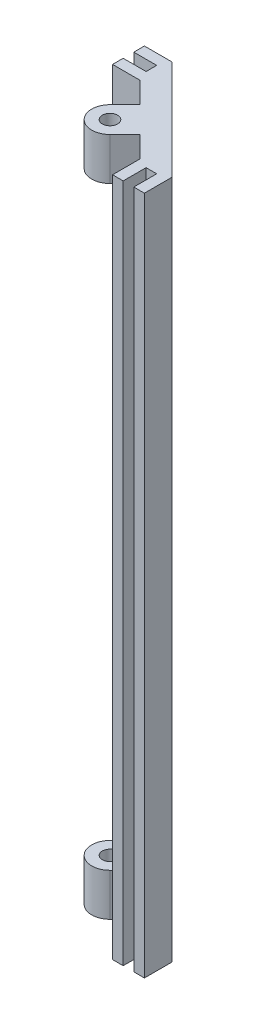
ISO-10303-21;
HEADER;
FILE_DESCRIPTION(('STEP AP214'),'2;1');
FILE_NAME('part.step','',(''),(''),'','','');
FILE_SCHEMA(('AUTOMOTIVE_DESIGN { 1 0 10303 214 1 1 1 1 }'));
ENDSEC;
DATA;
#1=APPLICATION_CONTEXT('core data for automotive mechanical design processes');
#2=APPLICATION_PROTOCOL_DEFINITION('international standard','automotive_design',2000,#1);
#3=PRODUCT_CONTEXT('',#1,'mechanical');
#4=PRODUCT('Part','Part','',(#3));
#5=PRODUCT_RELATED_PRODUCT_CATEGORY('part','',(#4));
#6=PRODUCT_DEFINITION_FORMATION('','',#4);
#7=PRODUCT_DEFINITION_CONTEXT('part definition',#1,'design');
#8=PRODUCT_DEFINITION('design','',#6,#7);
#9=PRODUCT_DEFINITION_SHAPE('','',#8);
#10=(LENGTH_UNIT() NAMED_UNIT(*) SI_UNIT(.MILLI.,.METRE.));
#11=(NAMED_UNIT(*) PLANE_ANGLE_UNIT() SI_UNIT($,.RADIAN.));
#12=(NAMED_UNIT(*) SI_UNIT($,.STERADIAN.) SOLID_ANGLE_UNIT());
#13=UNCERTAINTY_MEASURE_WITH_UNIT(LENGTH_MEASURE(1.E-05),#10,'distance_accuracy_value','');
#14=(GEOMETRIC_REPRESENTATION_CONTEXT(3) GLOBAL_UNCERTAINTY_ASSIGNED_CONTEXT((#13)) GLOBAL_UNIT_ASSIGNED_CONTEXT((#10,
#11,#12)) REPRESENTATION_CONTEXT('',''));
#15=CARTESIAN_POINT('',(0.,0.,0.));
#16=DIRECTION('',(0.,0.,1.));
#17=DIRECTION('',(1.,0.,0.));
#18=AXIS2_PLACEMENT_3D('',#15,#16,#17);
#19=CARTESIAN_POINT('',(22.2539461017924,203.2,-14.530925837673));
#20=DIRECTION('',(0.707106781186547,0.,-0.707106781186548));
#21=DIRECTION('',(-0.707106781186548,0.,-0.707106781186547));
#22=AXIS2_PLACEMENT_3D('',#19,#20,#21);
#23=PLANE('',#22);
#24=DIRECTION('',(0.,-1.,0.));
#25=VECTOR('',#24,1.);
#26=CARTESIAN_POINT('',(16.1473719394654,190.5,-20.6375));
#27=LINE('',#26,#25);
#28=CARTESIAN_POINT('',(16.1473719394654,190.5,-20.6375));
#29=VERTEX_POINT('',#28);
#30=CARTESIAN_POINT('',(16.1473719394654,12.7,-20.6375));
#31=VERTEX_POINT('',#30);
#32=EDGE_CURVE('E256',#29,#31,#27,.T.);
#33=ORIENTED_EDGE('',*,*,#32,.F.);
#34=DIRECTION('',(-0.707106781186554,0.,-0.707106781186541));
#35=VECTOR('',#34,1.);
#36=CARTESIAN_POINT('',(22.2539461017925,190.5,-14.530925837673));
#37=LINE('',#36,#35);
#38=CARTESIAN_POINT('',(14.5309258376729,190.5,-22.2539461017924));
#39=VERTEX_POINT('',#38);
#40=EDGE_CURVE('E269',#29,#39,#37,.T.);
#41=ORIENTED_EDGE('',*,*,#40,.T.);
#42=DIRECTION('',(0.,-1.,0.));
#43=VECTOR('',#42,1.);
#44=CARTESIAN_POINT('',(14.530925837673,203.2,-22.2539461017924));
#45=LINE('',#44,#43);
#46=CARTESIAN_POINT('',(14.530925837673,203.2,-22.2539461017924));
#47=VERTEX_POINT('',#46);
#48=EDGE_CURVE('E474',#47,#39,#45,.T.);
#49=ORIENTED_EDGE('',*,*,#48,.F.);
#50=DIRECTION('',(0.707106781186547,0.,0.707106781186548));
#51=VECTOR('',#50,1.);
#52=CARTESIAN_POINT('',(8.20987193946542,203.2,-28.575));
#53=LINE('',#52,#51);
#54=CARTESIAN_POINT('',(8.20987193946542,203.2,-28.575));
#55=VERTEX_POINT('',#54);
#56=EDGE_CURVE('E341',#55,#47,#53,.T.);
#57=ORIENTED_EDGE('',*,*,#56,.F.);
#58=DIRECTION('',(0.,-1.,0.));
#59=VECTOR('',#58,1.);
#60=CARTESIAN_POINT('',(8.20987193946542,203.2,-28.575));
#61=LINE('',#60,#59);
#62=CARTESIAN_POINT('',(8.20987193946542,0.,-28.575));
#63=VERTEX_POINT('',#62);
#64=EDGE_CURVE('E478',#55,#63,#61,.T.);
#65=ORIENTED_EDGE('',*,*,#64,.T.);
#66=DIRECTION('',(0.707106781186547,0.,0.707106781186548));
#67=VECTOR('',#66,1.);
#68=CARTESIAN_POINT('',(8.20987193946542,0.,-28.575));
#69=LINE('',#68,#67);
#70=CARTESIAN_POINT('',(14.530925837673,0.,-22.2539461017924));
#71=VERTEX_POINT('',#70);
#72=EDGE_CURVE('E402',#63,#71,#69,.T.);
#73=ORIENTED_EDGE('',*,*,#72,.T.);
#74=CARTESIAN_POINT('',(14.5309258376731,12.7,-22.2539461017922));
#75=VERTEX_POINT('',#74);
#76=EDGE_CURVE('E473',#75,#71,#45,.T.);
#77=ORIENTED_EDGE('',*,*,#76,.F.);
#78=DIRECTION('',(0.707106781186554,0.,0.707106781186541));
#79=VECTOR('',#78,1.);
#80=CARTESIAN_POINT('',(22.2539461017927,12.7,-14.5309258376728));
#81=LINE('',#80,#79);
#82=EDGE_CURVE('E274',#75,#31,#81,.T.);
#83=ORIENTED_EDGE('',*,*,#82,.T.);
#84=EDGE_LOOP('',(#33,#41,#49,#57,#65,#73,#77,#83));
#85=FACE_BOUND('',#84,.T.);
#86=ADVANCED_FACE('F39',(#85),#23,.F.);
#87=DIRECTION('',(0.,1.,0.));
#88=VECTOR('',#87,1.);
#89=CARTESIAN_POINT('',(20.6375,190.5,-16.1473719394654));
#90=LINE('',#89,#88);
#91=CARTESIAN_POINT('',(20.6375,12.7,-16.1473719394654));
#92=VERTEX_POINT('',#91);
#93=CARTESIAN_POINT('',(20.6375,190.5,-16.1473719394654));
#94=VERTEX_POINT('',#93);
#95=EDGE_CURVE('E260',#92,#94,#90,.T.);
#96=ORIENTED_EDGE('',*,*,#95,.F.);
#97=CARTESIAN_POINT('',(22.2539461017924,12.7,-14.530925837673));
#98=VERTEX_POINT('',#97);
#99=EDGE_CURVE('E232',#92,#98,#81,.T.);
#100=ORIENTED_EDGE('',*,*,#99,.T.);
#101=DIRECTION('',(0.,-1.,0.));
#102=VECTOR('',#101,1.);
#103=CARTESIAN_POINT('',(22.2539461017924,203.2,-14.530925837673));
#104=LINE('',#103,#102);
#105=CARTESIAN_POINT('',(22.2539461017924,0.,-14.530925837673));
#106=VERTEX_POINT('',#105);
#107=EDGE_CURVE('E458',#98,#106,#104,.T.);
#108=ORIENTED_EDGE('',*,*,#107,.T.);
#109=DIRECTION('',(0.707106781186548,0.,0.707106781186547));
#110=VECTOR('',#109,1.);
#111=CARTESIAN_POINT('',(22.2539461017924,0.,-14.530925837673));
#112=LINE('',#111,#110);
#113=CARTESIAN_POINT('',(28.575,0.,-8.20987193946542));
#114=VERTEX_POINT('',#113);
#115=EDGE_CURVE('E418',#106,#114,#112,.T.);
#116=ORIENTED_EDGE('',*,*,#115,.T.);
#117=DIRECTION('',(0.,-1.,0.));
#118=VECTOR('',#117,1.);
#119=CARTESIAN_POINT('',(28.575,203.2,-8.20987193946542));
#120=LINE('',#119,#118);
#121=CARTESIAN_POINT('',(28.575,203.2,-8.20987193946542));
#122=VERTEX_POINT('',#121);
#123=EDGE_CURVE('E454',#122,#114,#120,.T.);
#124=ORIENTED_EDGE('',*,*,#123,.F.);
#125=DIRECTION('',(0.707106781186548,0.,0.707106781186547));
#126=VECTOR('',#125,1.);
#127=CARTESIAN_POINT('',(22.2539461017924,203.2,-14.530925837673));
#128=LINE('',#127,#126);
#129=CARTESIAN_POINT('',(22.2539461017924,203.2,-14.530925837673));
#130=VERTEX_POINT('',#129);
#131=EDGE_CURVE('E353',#130,#122,#128,.T.);
#132=ORIENTED_EDGE('',*,*,#131,.F.);
#133=CARTESIAN_POINT('',(22.2539461017925,190.5,-14.530925837673));
#134=VERTEX_POINT('',#133);
#135=EDGE_CURVE('E459',#130,#134,#104,.T.);
#136=ORIENTED_EDGE('',*,*,#135,.T.);
#137=EDGE_CURVE('E270',#134,#94,#37,.T.);
#138=ORIENTED_EDGE('',*,*,#137,.T.);
#139=EDGE_LOOP('',(#96,#100,#108,#116,#124,#132,#136,#138));
#140=FACE_BOUND('',#139,.T.);
#141=ADVANCED_FACE('F529',(#140),#23,.F.);
#142=CARTESIAN_POINT('',(13.9023079091982,190.5,-6.17928764507862));
#143=DIRECTION('',(0.,-1.,0.));
#144=DIRECTION('',(0.,0.,-1.));
#145=AXIS2_PLACEMENT_3D('',#142,#143,#144);
#146=PLANE('',#145);
#147=CARTESIAN_POINT('',(13.9023079091981,190.5,-13.9023079091981));
#148=DIRECTION('',(0.,-1.,0.));
#149=DIRECTION('',(0.,0.,-1.));
#150=AXIS2_PLACEMENT_3D('',#147,#148,#149);
#151=CIRCLE('',#150,2.286);
#152=CARTESIAN_POINT('',(13.9023079091981,190.5,-16.1883079091981));
#153=VERTEX_POINT('',#152);
#154=EDGE_CURVE('E43',#153,#153,#151,.T.);
#155=ORIENTED_EDGE('',*,*,#154,.F.);
#156=EDGE_LOOP('',(#155));
#157=FACE_BOUND('',#156,.T.);
#158=ORIENTED_EDGE('',*,*,#40,.F.);
#159=DIRECTION('',(0.707106781186547,0.,-0.707106781186548));
#160=VECTOR('',#159,1.);
#161=CARTESIAN_POINT('',(15.2493463273585,190.5,-19.7394743878931));
#162=LINE('',#161,#160);
#163=CARTESIAN_POINT('',(15.2493463273585,190.5,-19.7394743878931));
#164=VERTEX_POINT('',#163);
#165=EDGE_CURVE('E57',#164,#29,#162,.T.);
#166=ORIENTED_EDGE('',*,*,#165,.F.);
#167=DIRECTION('',(-0.707106781186548,0.,-0.707106781186547));
#168=VECTOR('',#167,1.);
#169=CARTESIAN_POINT('',(15.2493463273585,190.5,-19.7394743878931));
#170=LINE('',#169,#168);
#171=CARTESIAN_POINT('',(19.7394743878931,190.5,-15.2493463273585));
#172=VERTEX_POINT('',#171);
#173=EDGE_CURVE('E61',#172,#164,#170,.T.);
#174=ORIENTED_EDGE('',*,*,#173,.F.);
#175=DIRECTION('',(0.707106781186547,0.,-0.707106781186548));
#176=VECTOR('',#175,1.);
#177=CARTESIAN_POINT('',(19.7394743878931,190.5,-15.2493463273585));
#178=LINE('',#177,#176);
#179=EDGE_CURVE('E238',#172,#94,#178,.T.);
#180=ORIENTED_EDGE('',*,*,#179,.T.);
#181=ORIENTED_EDGE('',*,*,#137,.F.);
#182=DIRECTION('',(0.707106781186541,0.,-0.707106781186554));
#183=VECTOR('',#182,1.);
#184=CARTESIAN_POINT('',(13.9023079091982,190.5,-6.17928764507862));
#185=LINE('',#184,#183);
#186=CARTESIAN_POINT('',(17.7638180412579,190.5,-10.0407977771384));
#187=VERTEX_POINT('',#186);
#188=EDGE_CURVE('E289',#187,#134,#185,.T.);
#189=ORIENTED_EDGE('',*,*,#188,.F.);
#190=CARTESIAN_POINT('',(13.9023079091981,190.5,-13.9023079091981));
#191=DIRECTION('',(0.,-1.,0.));
#192=DIRECTION('',(0.,0.,-1.));
#193=AXIS2_PLACEMENT_3D('',#190,#191,#192);
#194=CIRCLE('',#193,5.461);
#195=CARTESIAN_POINT('',(10.0407977771384,190.5,-17.7638180412578));
#196=VERTEX_POINT('',#195);
#197=EDGE_CURVE('E297',#187,#196,#194,.T.);
#198=ORIENTED_EDGE('',*,*,#197,.T.);
#199=DIRECTION('',(0.707106781186541,0.,-0.707106781186554));
#200=VECTOR('',#199,1.);
#201=CARTESIAN_POINT('',(6.17928764507871,190.5,-13.902307909198));
#202=LINE('',#201,#200);
#203=EDGE_CURVE('E285',#196,#39,#202,.T.);
#204=ORIENTED_EDGE('',*,*,#203,.T.);
#205=EDGE_LOOP('',(#158,#166,#174,#180,#181,#189,#198,#204));
#206=FACE_BOUND('',#205,.T.);
#207=ADVANCED_FACE('F520',(#157,#206),#146,.T.);
#208=CARTESIAN_POINT('',(13.9023079091984,12.7,-6.17928764507842));
#209=DIRECTION('',(0.,1.,0.));
#210=DIRECTION('',(-1.,0.,0.));
#211=AXIS2_PLACEMENT_3D('',#208,#209,#210);
#212=PLANE('',#211);
#213=CARTESIAN_POINT('',(13.9023079091981,12.7,-13.9023079091981));
#214=DIRECTION('',(0.,1.,0.));
#215=DIRECTION('',(-1.,0.,0.));
#216=AXIS2_PLACEMENT_3D('',#213,#214,#215);
#217=CIRCLE('',#216,2.286);
#218=CARTESIAN_POINT('',(11.6163079091981,12.7,-13.9023079091981));
#219=VERTEX_POINT('',#218);
#220=EDGE_CURVE('E293',#219,#219,#217,.T.);
#221=ORIENTED_EDGE('',*,*,#220,.F.);
#222=EDGE_LOOP('',(#221));
#223=FACE_BOUND('',#222,.T.);
#224=DIRECTION('',(0.707106781186548,0.,0.707106781186547));
#225=VECTOR('',#224,1.);
#226=CARTESIAN_POINT('',(15.2493463273585,12.7,-19.7394743878931));
#227=LINE('',#226,#225);
#228=CARTESIAN_POINT('',(15.2493463273585,12.7,-19.7394743878931));
#229=VERTEX_POINT('',#228);
#230=CARTESIAN_POINT('',(19.7394743878931,12.7,-15.2493463273585));
#231=VERTEX_POINT('',#230);
#232=EDGE_CURVE('E229',#229,#231,#227,.T.);
#233=ORIENTED_EDGE('',*,*,#232,.F.);
#234=DIRECTION('',(0.707106781186547,0.,-0.707106781186548));
#235=VECTOR('',#234,1.);
#236=CARTESIAN_POINT('',(15.2493463273585,12.7,-19.7394743878931));
#237=LINE('',#236,#235);
#238=EDGE_CURVE('E237',#229,#31,#237,.T.);
#239=ORIENTED_EDGE('',*,*,#238,.T.);
#240=ORIENTED_EDGE('',*,*,#82,.F.);
#241=DIRECTION('',(0.707106781186541,0.,-0.707106781186554));
#242=VECTOR('',#241,1.);
#243=CARTESIAN_POINT('',(6.17928764507891,12.7,-13.9023079091978));
#244=LINE('',#243,#242);
#245=CARTESIAN_POINT('',(10.0407977771386,12.7,-17.7638180412576));
#246=VERTEX_POINT('',#245);
#247=EDGE_CURVE('E281',#246,#75,#244,.T.);
#248=ORIENTED_EDGE('',*,*,#247,.F.);
#249=CARTESIAN_POINT('',(13.9023079091981,12.7,-13.9023079091981));
#250=DIRECTION('',(0.,1.,0.));
#251=DIRECTION('',(-1.,0.,0.));
#252=AXIS2_PLACEMENT_3D('',#249,#250,#251);
#253=CIRCLE('',#252,5.461);
#254=CARTESIAN_POINT('',(17.7638180412581,12.7,-10.0407977771382));
#255=VERTEX_POINT('',#254);
#256=EDGE_CURVE('E294',#246,#255,#253,.T.);
#257=ORIENTED_EDGE('',*,*,#256,.T.);
#258=DIRECTION('',(0.707106781186541,0.,-0.707106781186554));
#259=VECTOR('',#258,1.);
#260=CARTESIAN_POINT('',(13.9023079091984,12.7,-6.17928764507842));
#261=LINE('',#260,#259);
#262=EDGE_CURVE('E278',#255,#98,#261,.T.);
#263=ORIENTED_EDGE('',*,*,#262,.T.);
#264=ORIENTED_EDGE('',*,*,#99,.F.);
#265=DIRECTION('',(0.707106781186547,0.,-0.707106781186548));
#266=VECTOR('',#265,1.);
#267=CARTESIAN_POINT('',(19.7394743878931,12.7,-15.2493463273585));
#268=LINE('',#267,#266);
#269=EDGE_CURVE('E226',#231,#92,#268,.T.);
#270=ORIENTED_EDGE('',*,*,#269,.F.);
#271=EDGE_LOOP('',(#233,#239,#240,#248,#257,#263,#264,#270));
#272=FACE_BOUND('',#271,.T.);
#273=ADVANCED_FACE('F228',(#223,#272),#212,.T.);
#274=CARTESIAN_POINT('',(14.530925837673,203.2,-22.2539461017924));
#275=DIRECTION('',(0.707106781186548,0.,0.707106781186548));
#276=DIRECTION('',(0.707106781186548,0.,-0.707106781186548));
#277=AXIS2_PLACEMENT_3D('',#274,#275,#276);
#278=PLANE('',#277);
#279=ORIENTED_EDGE('',*,*,#203,.F.);
#280=DIRECTION('',(0.,-1.,0.));
#281=VECTOR('',#280,1.);
#282=CARTESIAN_POINT('',(10.0407977771384,203.2,-17.7638180412579));
#283=LINE('',#282,#281);
#284=CARTESIAN_POINT('',(10.0407977771384,203.2,-17.7638180412579));
#285=VERTEX_POINT('',#284);
#286=EDGE_CURVE('E469',#285,#196,#283,.T.);
#287=ORIENTED_EDGE('',*,*,#286,.F.);
#288=DIRECTION('',(-0.707106781186548,0.,0.707106781186548));
#289=VECTOR('',#288,1.);
#290=CARTESIAN_POINT('',(14.530925837673,203.2,-22.2539461017924));
#291=LINE('',#290,#289);
#292=EDGE_CURVE('E344',#47,#285,#291,.T.);
#293=ORIENTED_EDGE('',*,*,#292,.F.);
#294=ORIENTED_EDGE('',*,*,#48,.T.);
#295=EDGE_LOOP('',(#279,#287,#293,#294));
#296=FACE_BOUND('',#295,.T.);
#297=ADVANCED_FACE('F519',(#296),#278,.F.);
#298=ORIENTED_EDGE('',*,*,#247,.T.);
#299=ORIENTED_EDGE('',*,*,#76,.T.);
#300=DIRECTION('',(-0.707106781186548,0.,0.707106781186548));
#301=VECTOR('',#300,1.);
#302=CARTESIAN_POINT('',(14.530925837673,0.,-22.2539461017924));
#303=LINE('',#302,#301);
#304=CARTESIAN_POINT('',(10.0407977771384,0.,-17.7638180412579));
#305=VERTEX_POINT('',#304);
#306=EDGE_CURVE('E406',#71,#305,#303,.T.);
#307=ORIENTED_EDGE('',*,*,#306,.T.);
#308=EDGE_CURVE('E468',#246,#305,#283,.T.);
#309=ORIENTED_EDGE('',*,*,#308,.F.);
#310=EDGE_LOOP('',(#298,#299,#307,#309));
#311=FACE_BOUND('',#310,.T.);
#312=ADVANCED_FACE('F526',(#311),#278,.F.);
#313=CARTESIAN_POINT('',(13.9023079091981,203.2,-13.9023079091981));
#314=DIRECTION('',(0.,-1.,0.));
#315=DIRECTION('',(0.,0.,-1.));
#316=AXIS2_PLACEMENT_3D('',#313,#314,#315);
#317=CYLINDRICAL_SURFACE('',#316,5.461);
#318=ORIENTED_EDGE('',*,*,#197,.F.);
#319=DIRECTION('',(0.,-1.,0.));
#320=VECTOR('',#319,1.);
#321=CARTESIAN_POINT('',(17.7638180412579,203.2,-10.0407977771384));
#322=LINE('',#321,#320);
#323=CARTESIAN_POINT('',(17.7638180412579,203.2,-10.0407977771384));
#324=VERTEX_POINT('',#323);
#325=EDGE_CURVE('E464',#324,#187,#322,.T.);
#326=ORIENTED_EDGE('',*,*,#325,.F.);
#327=CARTESIAN_POINT('',(13.9023079091981,203.2,-13.9023079091981));
#328=DIRECTION('',(0.,1.,0.));
#329=DIRECTION('',(0.,0.,1.));
#330=AXIS2_PLACEMENT_3D('',#327,#328,#329);
#331=CIRCLE('',#330,5.461);
#332=EDGE_CURVE('E347',#285,#324,#331,.T.);
#333=ORIENTED_EDGE('',*,*,#332,.F.);
#334=ORIENTED_EDGE('',*,*,#286,.T.);
#335=EDGE_LOOP('',(#318,#326,#333,#334));
#336=FACE_BOUND('',#335,.T.);
#337=ADVANCED_FACE('F550',(#336),#317,.T.);
#338=ORIENTED_EDGE('',*,*,#256,.F.);
#339=ORIENTED_EDGE('',*,*,#308,.T.);
#340=CARTESIAN_POINT('',(13.9023079091981,0.,-13.9023079091981));
#341=DIRECTION('',(0.,1.,0.));
#342=DIRECTION('',(0.,0.,1.));
#343=AXIS2_PLACEMENT_3D('',#340,#341,#342);
#344=CIRCLE('',#343,5.461);
#345=CARTESIAN_POINT('',(17.7638180412579,0.,-10.0407977771384));
#346=VERTEX_POINT('',#345);
#347=EDGE_CURVE('E410',#305,#346,#344,.T.);
#348=ORIENTED_EDGE('',*,*,#347,.T.);
#349=EDGE_CURVE('E463',#255,#346,#322,.T.);
#350=ORIENTED_EDGE('',*,*,#349,.F.);
#351=EDGE_LOOP('',(#338,#339,#348,#350));
#352=FACE_BOUND('',#351,.T.);
#353=ADVANCED_FACE('F548',(#352),#317,.T.);
#354=CARTESIAN_POINT('',(17.7638180412579,203.2,-10.0407977771384));
#355=DIRECTION('',(-0.707106781186548,0.,-0.707106781186547));
#356=DIRECTION('',(-0.707106781186547,0.,0.707106781186548));
#357=AXIS2_PLACEMENT_3D('',#354,#355,#356);
#358=PLANE('',#357);
#359=ORIENTED_EDGE('',*,*,#188,.T.);
#360=ORIENTED_EDGE('',*,*,#135,.F.);
#361=DIRECTION('',(0.707106781186547,0.,-0.707106781186548));
#362=VECTOR('',#361,1.);
#363=CARTESIAN_POINT('',(17.7638180412579,203.2,-10.0407977771384));
#364=LINE('',#363,#362);
#365=EDGE_CURVE('E350',#324,#130,#364,.T.);
#366=ORIENTED_EDGE('',*,*,#365,.F.);
#367=ORIENTED_EDGE('',*,*,#325,.T.);
#368=EDGE_LOOP('',(#359,#360,#366,#367));
#369=FACE_BOUND('',#368,.T.);
#370=ADVANCED_FACE('F544',(#369),#358,.F.);
#371=ORIENTED_EDGE('',*,*,#262,.F.);
#372=ORIENTED_EDGE('',*,*,#349,.T.);
#373=DIRECTION('',(0.707106781186547,0.,-0.707106781186548));
#374=VECTOR('',#373,1.);
#375=CARTESIAN_POINT('',(17.7638180412579,0.,-10.0407977771384));
#376=LINE('',#375,#374);
#377=EDGE_CURVE('E414',#346,#106,#376,.T.);
#378=ORIENTED_EDGE('',*,*,#377,.T.);
#379=ORIENTED_EDGE('',*,*,#107,.F.);
#380=EDGE_LOOP('',(#371,#372,#378,#379));
#381=FACE_BOUND('',#380,.T.);
#382=ADVANCED_FACE('F547',(#381),#358,.F.);
#383=CARTESIAN_POINT('',(13.9023079091981,203.2,-13.9023079091981));
#384=DIRECTION('',(0.,-1.,0.));
#385=DIRECTION('',(0.,0.,-1.));
#386=AXIS2_PLACEMENT_3D('',#383,#384,#385);
#387=CYLINDRICAL_SURFACE('',#386,2.286);
#388=CARTESIAN_POINT('',(13.9023079091981,203.2,-13.9023079091981));
#389=DIRECTION('',(0.,1.,0.));
#390=DIRECTION('',(0.,0.,1.));
#391=AXIS2_PLACEMENT_3D('',#388,#389,#390);
#392=CIRCLE('',#391,2.286);
#393=CARTESIAN_POINT('',(13.9023079091981,203.2,-11.6163079091981));
#394=VERTEX_POINT('',#393);
#395=EDGE_CURVE('E301',#394,#394,#392,.T.);
#396=ORIENTED_EDGE('',*,*,#395,.T.);
#397=EDGE_LOOP('',(#396));
#398=FACE_BOUND('',#397,.T.);
#399=ORIENTED_EDGE('',*,*,#154,.T.);
#400=EDGE_LOOP('',(#399));
#401=FACE_BOUND('',#400,.T.);
#402=ADVANCED_FACE('F735',(#398,#401),#387,.F.);
#403=CARTESIAN_POINT('',(13.9023079091981,0.,-13.9023079091981));
#404=DIRECTION('',(0.,1.,0.));
#405=DIRECTION('',(0.,0.,1.));
#406=AXIS2_PLACEMENT_3D('',#403,#404,#405);
#407=CIRCLE('',#406,2.286);
#408=CARTESIAN_POINT('',(13.9023079091981,0.,-11.6163079091981));
#409=VERTEX_POINT('',#408);
#410=EDGE_CURVE('E300',#409,#409,#407,.T.);
#411=ORIENTED_EDGE('',*,*,#410,.F.);
#412=EDGE_LOOP('',(#411));
#413=FACE_BOUND('',#412,.T.);
#414=ORIENTED_EDGE('',*,*,#220,.T.);
#415=EDGE_LOOP('',(#414));
#416=FACE_BOUND('',#415,.T.);
#417=ADVANCED_FACE('F516',(#413,#416),#387,.F.);
#418=CARTESIAN_POINT('',(13.9023079091981,203.2,-13.9023079091981));
#419=DIRECTION('',(0.,1.,0.));
#420=DIRECTION('',(0.,0.,1.));
#421=AXIS2_PLACEMENT_3D('',#418,#419,#420);
#422=PLANE('',#421);
#423=DIRECTION('',(1.,0.,0.));
#424=VECTOR('',#423,1.);
#425=CARTESIAN_POINT('',(34.925,203.2,0.));
#426=LINE('',#425,#424);
#427=CARTESIAN_POINT('',(34.925,203.2,0.));
#428=VERTEX_POINT('',#427);
#429=CARTESIAN_POINT('',(38.1,203.2,0.));
#430=VERTEX_POINT('',#429);
#431=EDGE_CURVE('E309',#428,#430,#426,.T.);
#432=ORIENTED_EDGE('',*,*,#431,.T.);
#433=DIRECTION('',(0.,0.,-1.));
#434=VECTOR('',#433,1.);
#435=CARTESIAN_POINT('',(38.1,203.2,0.));
#436=LINE('',#435,#434);
#437=CARTESIAN_POINT('',(38.1,203.2,-8.20987193946542));
#438=VERTEX_POINT('',#437);
#439=EDGE_CURVE('E313',#430,#438,#436,.T.);
#440=ORIENTED_EDGE('',*,*,#439,.T.);
#441=DIRECTION('',(-0.707106781186547,0.,-0.707106781186547));
#442=VECTOR('',#441,1.);
#443=CARTESIAN_POINT('',(38.1,203.2,-8.20987193946542));
#444=LINE('',#443,#442);
#445=CARTESIAN_POINT('',(8.20987193946542,203.2,-38.1));
#446=VERTEX_POINT('',#445);
#447=EDGE_CURVE('E317',#438,#446,#444,.T.);
#448=ORIENTED_EDGE('',*,*,#447,.T.);
#449=DIRECTION('',(-1.,0.,0.));
#450=VECTOR('',#449,1.);
#451=CARTESIAN_POINT('',(8.20987193946542,203.2,-38.1));
#452=LINE('',#451,#450);
#453=CARTESIAN_POINT('',(0.,203.2,-38.1));
#454=VERTEX_POINT('',#453);
#455=EDGE_CURVE('E320',#446,#454,#452,.T.);
#456=ORIENTED_EDGE('',*,*,#455,.T.);
#457=DIRECTION('',(0.,0.,1.));
#458=VECTOR('',#457,1.);
#459=CARTESIAN_POINT('',(0.,203.2,-38.1));
#460=LINE('',#459,#458);
#461=CARTESIAN_POINT('',(0.,203.2,-34.925));
#462=VERTEX_POINT('',#461);
#463=EDGE_CURVE('E323',#454,#462,#460,.T.);
#464=ORIENTED_EDGE('',*,*,#463,.T.);
#465=DIRECTION('',(1.,0.,0.));
#466=VECTOR('',#465,1.);
#467=CARTESIAN_POINT('',(0.,203.2,-34.925));
#468=LINE('',#467,#466);
#469=CARTESIAN_POINT('',(6.858,203.2,-34.925));
#470=VERTEX_POINT('',#469);
#471=EDGE_CURVE('E326',#462,#470,#468,.T.);
#472=ORIENTED_EDGE('',*,*,#471,.T.);
#473=DIRECTION('',(0.,0.,1.));
#474=VECTOR('',#473,1.);
#475=CARTESIAN_POINT('',(6.858,203.2,-31.75));
#476=LINE('',#475,#474);
#477=CARTESIAN_POINT('',(6.858,203.2,-31.75));
#478=VERTEX_POINT('',#477);
#479=EDGE_CURVE('E329',#470,#478,#476,.T.);
#480=ORIENTED_EDGE('',*,*,#479,.T.);
#481=DIRECTION('',(-1.,0.,0.));
#482=VECTOR('',#481,1.);
#483=CARTESIAN_POINT('',(0.,203.2,-31.75));
#484=LINE('',#483,#482);
#485=CARTESIAN_POINT('',(0.,203.2,-31.75));
#486=VERTEX_POINT('',#485);
#487=EDGE_CURVE('E332',#478,#486,#484,.T.);
#488=ORIENTED_EDGE('',*,*,#487,.T.);
#489=DIRECTION('',(0.,0.,1.));
#490=VECTOR('',#489,1.);
#491=CARTESIAN_POINT('',(0.,203.2,-31.75));
#492=LINE('',#491,#490);
#493=CARTESIAN_POINT('',(0.,203.2,-28.575));
#494=VERTEX_POINT('',#493);
#495=EDGE_CURVE('E335',#486,#494,#492,.T.);
#496=ORIENTED_EDGE('',*,*,#495,.T.);
#497=DIRECTION('',(1.,0.,0.));
#498=VECTOR('',#497,1.);
#499=CARTESIAN_POINT('',(0.,203.2,-28.575));
#500=LINE('',#499,#498);
#501=EDGE_CURVE('E338',#494,#55,#500,.T.);
#502=ORIENTED_EDGE('',*,*,#501,.T.);
#503=ORIENTED_EDGE('',*,*,#56,.T.);
#504=ORIENTED_EDGE('',*,*,#292,.T.);
#505=ORIENTED_EDGE('',*,*,#332,.T.);
#506=ORIENTED_EDGE('',*,*,#365,.T.);
#507=ORIENTED_EDGE('',*,*,#131,.T.);
#508=DIRECTION('',(0.,0.,1.));
#509=VECTOR('',#508,1.);
#510=CARTESIAN_POINT('',(28.575,203.2,-8.20987193946542));
#511=LINE('',#510,#509);
#512=CARTESIAN_POINT('',(28.575,203.2,0.));
#513=VERTEX_POINT('',#512);
#514=EDGE_CURVE('E356',#122,#513,#511,.T.);
#515=ORIENTED_EDGE('',*,*,#514,.T.);
#516=DIRECTION('',(1.,0.,0.));
#517=VECTOR('',#516,1.);
#518=CARTESIAN_POINT('',(28.575,203.2,0.));
#519=LINE('',#518,#517);
#520=CARTESIAN_POINT('',(31.75,203.2,0.));
#521=VERTEX_POINT('',#520);
#522=EDGE_CURVE('E359',#513,#521,#519,.T.);
#523=ORIENTED_EDGE('',*,*,#522,.T.);
#524=DIRECTION('',(0.,0.,-1.));
#525=VECTOR('',#524,1.);
#526=CARTESIAN_POINT('',(31.75,203.2,0.));
#527=LINE('',#526,#525);
#528=CARTESIAN_POINT('',(31.75,203.2,-6.858));
#529=VERTEX_POINT('',#528);
#530=EDGE_CURVE('E362',#521,#529,#527,.T.);
#531=ORIENTED_EDGE('',*,*,#530,.T.);
#532=DIRECTION('',(1.,0.,0.));
#533=VECTOR('',#532,1.);
#534=CARTESIAN_POINT('',(31.75,203.2,-6.858));
#535=LINE('',#534,#533);
#536=CARTESIAN_POINT('',(34.925,203.2,-6.858));
#537=VERTEX_POINT('',#536);
#538=EDGE_CURVE('E365',#529,#537,#535,.T.);
#539=ORIENTED_EDGE('',*,*,#538,.T.);
#540=DIRECTION('',(0.,0.,1.));
#541=VECTOR('',#540,1.);
#542=CARTESIAN_POINT('',(34.925,203.2,0.));
#543=LINE('',#542,#541);
#544=EDGE_CURVE('E368',#537,#428,#543,.T.);
#545=ORIENTED_EDGE('',*,*,#544,.T.);
#546=EDGE_LOOP('',(#432,#440,#448,#456,#464,#472,#480,#488,#496,#502,#503,#504,#505,#506,#507,
#515,#523,#531,#539,#545));
#547=FACE_BOUND('',#546,.T.);
#548=ORIENTED_EDGE('',*,*,#395,.F.);
#549=EDGE_LOOP('',(#548));
#550=FACE_BOUND('',#549,.T.);
#551=ADVANCED_FACE('F610',(#547,#550),#422,.T.);
#552=CARTESIAN_POINT('',(13.9023079091981,0.,-13.9023079091981));
#553=DIRECTION('',(0.,1.,0.));
#554=DIRECTION('',(0.,0.,1.));
#555=AXIS2_PLACEMENT_3D('',#552,#553,#554);
#556=PLANE('',#555);
#557=DIRECTION('',(1.,0.,0.));
#558=VECTOR('',#557,1.);
#559=CARTESIAN_POINT('',(34.925,0.,0.));
#560=LINE('',#559,#558);
#561=CARTESIAN_POINT('',(34.925,0.,0.));
#562=VERTEX_POINT('',#561);
#563=CARTESIAN_POINT('',(38.1,0.,0.));
#564=VERTEX_POINT('',#563);
#565=EDGE_CURVE('E305',#562,#564,#560,.T.);
#566=ORIENTED_EDGE('',*,*,#565,.F.);
#567=DIRECTION('',(0.,0.,1.));
#568=VECTOR('',#567,1.);
#569=CARTESIAN_POINT('',(34.925,0.,0.));
#570=LINE('',#569,#568);
#571=CARTESIAN_POINT('',(34.925,0.,-6.858));
#572=VERTEX_POINT('',#571);
#573=EDGE_CURVE('E314',#572,#562,#570,.T.);
#574=ORIENTED_EDGE('',*,*,#573,.F.);
#575=DIRECTION('',(1.,0.,0.));
#576=VECTOR('',#575,1.);
#577=CARTESIAN_POINT('',(31.75,0.,-6.858));
#578=LINE('',#577,#576);
#579=CARTESIAN_POINT('',(31.75,0.,-6.858));
#580=VERTEX_POINT('',#579);
#581=EDGE_CURVE('E430',#580,#572,#578,.T.);
#582=ORIENTED_EDGE('',*,*,#581,.F.);
#583=DIRECTION('',(0.,0.,-1.));
#584=VECTOR('',#583,1.);
#585=CARTESIAN_POINT('',(31.75,0.,0.));
#586=LINE('',#585,#584);
#587=CARTESIAN_POINT('',(31.75,0.,0.));
#588=VERTEX_POINT('',#587);
#589=EDGE_CURVE('E427',#588,#580,#586,.T.);
#590=ORIENTED_EDGE('',*,*,#589,.F.);
#591=DIRECTION('',(1.,0.,0.));
#592=VECTOR('',#591,1.);
#593=CARTESIAN_POINT('',(28.575,0.,0.));
#594=LINE('',#593,#592);
#595=CARTESIAN_POINT('',(28.575,0.,0.));
#596=VERTEX_POINT('',#595);
#597=EDGE_CURVE('E424',#596,#588,#594,.T.);
#598=ORIENTED_EDGE('',*,*,#597,.F.);
#599=DIRECTION('',(0.,0.,1.));
#600=VECTOR('',#599,1.);
#601=CARTESIAN_POINT('',(28.575,0.,-8.20987193946542));
#602=LINE('',#601,#600);
#603=EDGE_CURVE('E421',#114,#596,#602,.T.);
#604=ORIENTED_EDGE('',*,*,#603,.F.);
#605=ORIENTED_EDGE('',*,*,#115,.F.);
#606=ORIENTED_EDGE('',*,*,#377,.F.);
#607=ORIENTED_EDGE('',*,*,#347,.F.);
#608=ORIENTED_EDGE('',*,*,#306,.F.);
#609=ORIENTED_EDGE('',*,*,#72,.F.);
#610=DIRECTION('',(1.,0.,0.));
#611=VECTOR('',#610,1.);
#612=CARTESIAN_POINT('',(0.,0.,-28.575));
#613=LINE('',#612,#611);
#614=CARTESIAN_POINT('',(0.,0.,-28.575));
#615=VERTEX_POINT('',#614);
#616=EDGE_CURVE('E399',#615,#63,#613,.T.);
#617=ORIENTED_EDGE('',*,*,#616,.F.);
#618=DIRECTION('',(0.,0.,1.));
#619=VECTOR('',#618,1.);
#620=CARTESIAN_POINT('',(0.,0.,-31.75));
#621=LINE('',#620,#619);
#622=CARTESIAN_POINT('',(0.,0.,-31.75));
#623=VERTEX_POINT('',#622);
#624=EDGE_CURVE('E396',#623,#615,#621,.T.);
#625=ORIENTED_EDGE('',*,*,#624,.F.);
#626=DIRECTION('',(-1.,0.,0.));
#627=VECTOR('',#626,1.);
#628=CARTESIAN_POINT('',(0.,0.,-31.75));
#629=LINE('',#628,#627);
#630=CARTESIAN_POINT('',(6.858,0.,-31.75));
#631=VERTEX_POINT('',#630);
#632=EDGE_CURVE('E393',#631,#623,#629,.T.);
#633=ORIENTED_EDGE('',*,*,#632,.F.);
#634=DIRECTION('',(0.,0.,1.));
#635=VECTOR('',#634,1.);
#636=CARTESIAN_POINT('',(6.858,0.,-31.75));
#637=LINE('',#636,#635);
#638=CARTESIAN_POINT('',(6.858,0.,-34.925));
#639=VERTEX_POINT('',#638);
#640=EDGE_CURVE('E390',#639,#631,#637,.T.);
#641=ORIENTED_EDGE('',*,*,#640,.F.);
#642=DIRECTION('',(1.,0.,0.));
#643=VECTOR('',#642,1.);
#644=CARTESIAN_POINT('',(0.,0.,-34.925));
#645=LINE('',#644,#643);
#646=CARTESIAN_POINT('',(0.,0.,-34.925));
#647=VERTEX_POINT('',#646);
#648=EDGE_CURVE('E387',#647,#639,#645,.T.);
#649=ORIENTED_EDGE('',*,*,#648,.F.);
#650=DIRECTION('',(0.,0.,1.));
#651=VECTOR('',#650,1.);
#652=CARTESIAN_POINT('',(0.,0.,-38.1));
#653=LINE('',#652,#651);
#654=CARTESIAN_POINT('',(0.,0.,-38.1));
#655=VERTEX_POINT('',#654);
#656=EDGE_CURVE('E384',#655,#647,#653,.T.);
#657=ORIENTED_EDGE('',*,*,#656,.F.);
#658=DIRECTION('',(-1.,0.,0.));
#659=VECTOR('',#658,1.);
#660=CARTESIAN_POINT('',(8.20987193946542,0.,-38.1));
#661=LINE('',#660,#659);
#662=CARTESIAN_POINT('',(8.20987193946542,0.,-38.1));
#663=VERTEX_POINT('',#662);
#664=EDGE_CURVE('E381',#663,#655,#661,.T.);
#665=ORIENTED_EDGE('',*,*,#664,.F.);
#666=DIRECTION('',(-0.707106781186547,0.,-0.707106781186547));
#667=VECTOR('',#666,1.);
#668=CARTESIAN_POINT('',(38.1,0.,-8.20987193946542));
#669=LINE('',#668,#667);
#670=CARTESIAN_POINT('',(38.1,0.,-8.20987193946542));
#671=VERTEX_POINT('',#670);
#672=EDGE_CURVE('E378',#671,#663,#669,.T.);
#673=ORIENTED_EDGE('',*,*,#672,.F.);
#674=DIRECTION('',(0.,0.,-1.));
#675=VECTOR('',#674,1.);
#676=CARTESIAN_POINT('',(38.1,0.,0.));
#677=LINE('',#676,#675);
#678=EDGE_CURVE('E375',#564,#671,#677,.T.);
#679=ORIENTED_EDGE('',*,*,#678,.F.);
#680=EDGE_LOOP('',(#566,#574,#582,#590,#598,#604,#605,#606,#607,#608,#609,#617,#625,#633,#641,
#649,#657,#665,#673,#679));
#681=FACE_BOUND('',#680,.T.);
#682=ORIENTED_EDGE('',*,*,#410,.T.);
#683=EDGE_LOOP('',(#682));
#684=FACE_BOUND('',#683,.T.);
#685=ADVANCED_FACE('F591',(#681,#684),#556,.F.);
#686=CARTESIAN_POINT('',(34.925,203.2,0.));
#687=DIRECTION('',(0.,0.,-1.));
#688=DIRECTION('',(-1.,0.,0.));
#689=AXIS2_PLACEMENT_3D('',#686,#687,#688);
#690=PLANE('',#689);
#691=ORIENTED_EDGE('',*,*,#565,.T.);
#692=DIRECTION('',(0.,-1.,0.));
#693=VECTOR('',#692,1.);
#694=CARTESIAN_POINT('',(38.1,203.2,0.));
#695=LINE('',#694,#693);
#696=EDGE_CURVE('E11',#430,#564,#695,.T.);
#697=ORIENTED_EDGE('',*,*,#696,.F.);
#698=ORIENTED_EDGE('',*,*,#431,.F.);
#699=DIRECTION('',(0.,-1.,0.));
#700=VECTOR('',#699,1.);
#701=CARTESIAN_POINT('',(34.925,203.2,0.));
#702=LINE('',#701,#700);
#703=EDGE_CURVE('E371',#428,#562,#702,.T.);
#704=ORIENTED_EDGE('',*,*,#703,.T.);
#705=EDGE_LOOP('',(#691,#697,#698,#704));
#706=FACE_BOUND('',#705,.T.);
#707=ADVANCED_FACE('F41',(#706),#690,.F.);
#708=CARTESIAN_POINT('',(38.1,203.2,0.));
#709=DIRECTION('',(-1.,0.,0.));
#710=DIRECTION('',(0.,0.,1.));
#711=AXIS2_PLACEMENT_3D('',#708,#709,#710);
#712=PLANE('',#711);
#713=ORIENTED_EDGE('',*,*,#678,.T.);
#714=DIRECTION('',(0.,-1.,0.));
#715=VECTOR('',#714,1.);
#716=CARTESIAN_POINT('',(38.1,203.2,-8.20987193946542));
#717=LINE('',#716,#715);
#718=EDGE_CURVE('E49',#438,#671,#717,.T.);
#719=ORIENTED_EDGE('',*,*,#718,.F.);
#720=ORIENTED_EDGE('',*,*,#439,.F.);
#721=ORIENTED_EDGE('',*,*,#696,.T.);
#722=EDGE_LOOP('',(#713,#719,#720,#721));
#723=FACE_BOUND('',#722,.T.);
#724=ADVANCED_FACE('F584',(#723),#712,.F.);
#725=CARTESIAN_POINT('',(38.1,203.2,-8.20987193946542));
#726=DIRECTION('',(-0.707106781186548,0.,0.707106781186548));
#727=DIRECTION('',(0.707106781186548,0.,0.707106781186548));
#728=AXIS2_PLACEMENT_3D('',#725,#726,#727);
#729=PLANE('',#728);
#730=ORIENTED_EDGE('',*,*,#672,.T.);
#731=DIRECTION('',(0.,-1.,0.));
#732=VECTOR('',#731,1.);
#733=CARTESIAN_POINT('',(8.20987193946542,203.2,-38.1));
#734=LINE('',#733,#732);
#735=EDGE_CURVE('E506',#446,#663,#734,.T.);
#736=ORIENTED_EDGE('',*,*,#735,.F.);
#737=ORIENTED_EDGE('',*,*,#447,.F.);
#738=ORIENTED_EDGE('',*,*,#718,.T.);
#739=EDGE_LOOP('',(#730,#736,#737,#738));
#740=FACE_BOUND('',#739,.T.);
#741=ADVANCED_FACE('F581',(#740),#729,.F.);
#742=CARTESIAN_POINT('',(8.20987193946542,203.2,-38.1));
#743=DIRECTION('',(0.,0.,1.));
#744=DIRECTION('',(1.,0.,0.));
#745=AXIS2_PLACEMENT_3D('',#742,#743,#744);
#746=PLANE('',#745);
#747=ORIENTED_EDGE('',*,*,#664,.T.);
#748=DIRECTION('',(0.,-1.,0.));
#749=VECTOR('',#748,1.);
#750=CARTESIAN_POINT('',(0.,203.2,-38.1));
#751=LINE('',#750,#749);
#752=EDGE_CURVE('E502',#454,#655,#751,.T.);
#753=ORIENTED_EDGE('',*,*,#752,.F.);
#754=ORIENTED_EDGE('',*,*,#455,.F.);
#755=ORIENTED_EDGE('',*,*,#735,.T.);
#756=EDGE_LOOP('',(#747,#753,#754,#755));
#757=FACE_BOUND('',#756,.T.);
#758=ADVANCED_FACE('F577',(#757),#746,.F.);
#759=CARTESIAN_POINT('',(0.,203.2,-38.1));
#760=DIRECTION('',(1.,0.,0.));
#761=DIRECTION('',(0.,0.,-1.));
#762=AXIS2_PLACEMENT_3D('',#759,#760,#761);
#763=PLANE('',#762);
#764=ORIENTED_EDGE('',*,*,#656,.T.);
#765=DIRECTION('',(0.,-1.,0.));
#766=VECTOR('',#765,1.);
#767=CARTESIAN_POINT('',(0.,203.2,-34.925));
#768=LINE('',#767,#766);
#769=EDGE_CURVE('E498',#462,#647,#768,.T.);
#770=ORIENTED_EDGE('',*,*,#769,.F.);
#771=ORIENTED_EDGE('',*,*,#463,.F.);
#772=ORIENTED_EDGE('',*,*,#752,.T.);
#773=EDGE_LOOP('',(#764,#770,#771,#772));
#774=FACE_BOUND('',#773,.T.);
#775=ADVANCED_FACE('F573',(#774),#763,.F.);
#776=CARTESIAN_POINT('',(0.,203.2,-34.925));
#777=DIRECTION('',(0.,0.,-1.));
#778=DIRECTION('',(-1.,0.,0.));
#779=AXIS2_PLACEMENT_3D('',#776,#777,#778);
#780=PLANE('',#779);
#781=ORIENTED_EDGE('',*,*,#648,.T.);
#782=DIRECTION('',(0.,-1.,0.));
#783=VECTOR('',#782,1.);
#784=CARTESIAN_POINT('',(6.858,203.2,-34.925));
#785=LINE('',#784,#783);
#786=EDGE_CURVE('E494',#470,#639,#785,.T.);
#787=ORIENTED_EDGE('',*,*,#786,.F.);
#788=ORIENTED_EDGE('',*,*,#471,.F.);
#789=ORIENTED_EDGE('',*,*,#769,.T.);
#790=EDGE_LOOP('',(#781,#787,#788,#789));
#791=FACE_BOUND('',#790,.T.);
#792=ADVANCED_FACE('F569',(#791),#780,.F.);
#793=CARTESIAN_POINT('',(6.858,203.2,-31.75));
#794=DIRECTION('',(1.,0.,0.));
#795=DIRECTION('',(0.,0.,-1.));
#796=AXIS2_PLACEMENT_3D('',#793,#794,#795);
#797=PLANE('',#796);
#798=ORIENTED_EDGE('',*,*,#640,.T.);
#799=DIRECTION('',(0.,-1.,0.));
#800=VECTOR('',#799,1.);
#801=CARTESIAN_POINT('',(6.858,203.2,-31.75));
#802=LINE('',#801,#800);
#803=EDGE_CURVE('E490',#478,#631,#802,.T.);
#804=ORIENTED_EDGE('',*,*,#803,.F.);
#805=ORIENTED_EDGE('',*,*,#479,.F.);
#806=ORIENTED_EDGE('',*,*,#786,.T.);
#807=EDGE_LOOP('',(#798,#804,#805,#806));
#808=FACE_BOUND('',#807,.T.);
#809=ADVANCED_FACE('F565',(#808),#797,.F.);
#810=CARTESIAN_POINT('',(0.,203.2,-31.75));
#811=DIRECTION('',(0.,0.,1.));
#812=DIRECTION('',(1.,0.,0.));
#813=AXIS2_PLACEMENT_3D('',#810,#811,#812);
#814=PLANE('',#813);
#815=ORIENTED_EDGE('',*,*,#632,.T.);
#816=DIRECTION('',(0.,-1.,0.));
#817=VECTOR('',#816,1.);
#818=CARTESIAN_POINT('',(0.,203.2,-31.75));
#819=LINE('',#818,#817);
#820=EDGE_CURVE('E486',#486,#623,#819,.T.);
#821=ORIENTED_EDGE('',*,*,#820,.F.);
#822=ORIENTED_EDGE('',*,*,#487,.F.);
#823=ORIENTED_EDGE('',*,*,#803,.T.);
#824=EDGE_LOOP('',(#815,#821,#822,#823));
#825=FACE_BOUND('',#824,.T.);
#826=ADVANCED_FACE('F561',(#825),#814,.F.);
#827=CARTESIAN_POINT('',(0.,203.2,-31.75));
#828=DIRECTION('',(1.,0.,0.));
#829=DIRECTION('',(0.,0.,-1.));
#830=AXIS2_PLACEMENT_3D('',#827,#828,#829);
#831=PLANE('',#830);
#832=ORIENTED_EDGE('',*,*,#624,.T.);
#833=DIRECTION('',(0.,-1.,0.));
#834=VECTOR('',#833,1.);
#835=CARTESIAN_POINT('',(0.,203.2,-28.575));
#836=LINE('',#835,#834);
#837=EDGE_CURVE('E482',#494,#615,#836,.T.);
#838=ORIENTED_EDGE('',*,*,#837,.F.);
#839=ORIENTED_EDGE('',*,*,#495,.F.);
#840=ORIENTED_EDGE('',*,*,#820,.T.);
#841=EDGE_LOOP('',(#832,#838,#839,#840));
#842=FACE_BOUND('',#841,.T.);
#843=ADVANCED_FACE('F557',(#842),#831,.F.);
#844=CARTESIAN_POINT('',(0.,203.2,-28.575));
#845=DIRECTION('',(0.,0.,-1.));
#846=DIRECTION('',(-1.,0.,0.));
#847=AXIS2_PLACEMENT_3D('',#844,#845,#846);
#848=PLANE('',#847);
#849=ORIENTED_EDGE('',*,*,#616,.T.);
#850=ORIENTED_EDGE('',*,*,#64,.F.);
#851=ORIENTED_EDGE('',*,*,#501,.F.);
#852=ORIENTED_EDGE('',*,*,#837,.T.);
#853=EDGE_LOOP('',(#849,#850,#851,#852));
#854=FACE_BOUND('',#853,.T.);
#855=ADVANCED_FACE('F554',(#854),#848,.F.);
#856=CARTESIAN_POINT('',(28.575,203.2,-8.20987193946542));
#857=DIRECTION('',(1.,0.,0.));
#858=DIRECTION('',(0.,0.,-1.));
#859=AXIS2_PLACEMENT_3D('',#856,#857,#858);
#860=PLANE('',#859);
#861=ORIENTED_EDGE('',*,*,#603,.T.);
#862=DIRECTION('',(0.,-1.,0.));
#863=VECTOR('',#862,1.);
#864=CARTESIAN_POINT('',(28.575,203.2,0.));
#865=LINE('',#864,#863);
#866=EDGE_CURVE('E450',#513,#596,#865,.T.);
#867=ORIENTED_EDGE('',*,*,#866,.F.);
#868=ORIENTED_EDGE('',*,*,#514,.F.);
#869=ORIENTED_EDGE('',*,*,#123,.T.);
#870=EDGE_LOOP('',(#861,#867,#868,#869));
#871=FACE_BOUND('',#870,.T.);
#872=ADVANCED_FACE('F542',(#871),#860,.F.);
#873=CARTESIAN_POINT('',(28.575,203.2,0.));
#874=DIRECTION('',(0.,0.,-1.));
#875=DIRECTION('',(-1.,0.,0.));
#876=AXIS2_PLACEMENT_3D('',#873,#874,#875);
#877=PLANE('',#876);
#878=ORIENTED_EDGE('',*,*,#597,.T.);
#879=DIRECTION('',(0.,-1.,0.));
#880=VECTOR('',#879,1.);
#881=CARTESIAN_POINT('',(31.75,203.2,0.));
#882=LINE('',#881,#880);
#883=EDGE_CURVE('E446',#521,#588,#882,.T.);
#884=ORIENTED_EDGE('',*,*,#883,.F.);
#885=ORIENTED_EDGE('',*,*,#522,.F.);
#886=ORIENTED_EDGE('',*,*,#866,.T.);
#887=EDGE_LOOP('',(#878,#884,#885,#886));
#888=FACE_BOUND('',#887,.T.);
#889=ADVANCED_FACE('F634',(#888),#877,.F.);
#890=CARTESIAN_POINT('',(31.75,203.2,0.));
#891=DIRECTION('',(-1.,0.,0.));
#892=DIRECTION('',(0.,0.,1.));
#893=AXIS2_PLACEMENT_3D('',#890,#891,#892);
#894=PLANE('',#893);
#895=ORIENTED_EDGE('',*,*,#589,.T.);
#896=DIRECTION('',(0.,-1.,0.));
#897=VECTOR('',#896,1.);
#898=CARTESIAN_POINT('',(31.75,203.2,-6.858));
#899=LINE('',#898,#897);
#900=EDGE_CURVE('E442',#529,#580,#899,.T.);
#901=ORIENTED_EDGE('',*,*,#900,.F.);
#902=ORIENTED_EDGE('',*,*,#530,.F.);
#903=ORIENTED_EDGE('',*,*,#883,.T.);
#904=EDGE_LOOP('',(#895,#901,#902,#903));
#905=FACE_BOUND('',#904,.T.);
#906=ADVANCED_FACE('F628',(#905),#894,.F.);
#907=CARTESIAN_POINT('',(31.75,203.2,-6.858));
#908=DIRECTION('',(0.,0.,-1.));
#909=DIRECTION('',(-1.,0.,0.));
#910=AXIS2_PLACEMENT_3D('',#907,#908,#909);
#911=PLANE('',#910);
#912=ORIENTED_EDGE('',*,*,#581,.T.);
#913=DIRECTION('',(0.,-1.,0.));
#914=VECTOR('',#913,1.);
#915=CARTESIAN_POINT('',(34.925,203.2,-6.858));
#916=LINE('',#915,#914);
#917=EDGE_CURVE('E438',#537,#572,#916,.T.);
#918=ORIENTED_EDGE('',*,*,#917,.F.);
#919=ORIENTED_EDGE('',*,*,#538,.F.);
#920=ORIENTED_EDGE('',*,*,#900,.T.);
#921=EDGE_LOOP('',(#912,#918,#919,#920));
#922=FACE_BOUND('',#921,.T.);
#923=ADVANCED_FACE('F624',(#922),#911,.F.);
#924=CARTESIAN_POINT('',(34.925,203.2,0.));
#925=DIRECTION('',(1.,0.,0.));
#926=DIRECTION('',(0.,0.,-1.));
#927=AXIS2_PLACEMENT_3D('',#924,#925,#926);
#928=PLANE('',#927);
#929=ORIENTED_EDGE('',*,*,#573,.T.);
#930=ORIENTED_EDGE('',*,*,#703,.F.);
#931=ORIENTED_EDGE('',*,*,#544,.F.);
#932=ORIENTED_EDGE('',*,*,#917,.T.);
#933=EDGE_LOOP('',(#929,#930,#931,#932));
#934=FACE_BOUND('',#933,.T.);
#935=ADVANCED_FACE('F620',(#934),#928,.F.);
#936=CARTESIAN_POINT('',(15.2493463273585,190.5,-19.7394743878931));
#937=DIRECTION('',(0.707106781186548,0.,0.707106781186547));
#938=DIRECTION('',(0.707106781186547,0.,-0.707106781186548));
#939=AXIS2_PLACEMENT_3D('',#936,#937,#938);
#940=PLANE('',#939);
#941=ORIENTED_EDGE('',*,*,#32,.T.);
#942=ORIENTED_EDGE('',*,*,#238,.F.);
#943=DIRECTION('',(0.,-1.,0.));
#944=VECTOR('',#943,1.);
#945=CARTESIAN_POINT('',(15.2493463273585,190.5,-19.7394743878931));
#946=LINE('',#945,#944);
#947=EDGE_CURVE('E245',#164,#229,#946,.T.);
#948=ORIENTED_EDGE('',*,*,#947,.F.);
#949=ORIENTED_EDGE('',*,*,#165,.T.);
#950=EDGE_LOOP('',(#941,#942,#948,#949));
#951=FACE_BOUND('',#950,.T.);
#952=ADVANCED_FACE('F680',(#951),#940,.F.);
#953=CARTESIAN_POINT('',(19.7394743878931,190.5,-15.2493463273585));
#954=DIRECTION('',(-0.707106781186548,0.,-0.707106781186547));
#955=DIRECTION('',(-0.707106781186547,0.,0.707106781186548));
#956=AXIS2_PLACEMENT_3D('',#953,#954,#955);
#957=PLANE('',#956);
#958=ORIENTED_EDGE('',*,*,#95,.T.);
#959=ORIENTED_EDGE('',*,*,#179,.F.);
#960=DIRECTION('',(0.,1.,0.));
#961=VECTOR('',#960,1.);
#962=CARTESIAN_POINT('',(19.7394743878931,190.5,-15.2493463273585));
#963=LINE('',#962,#961);
#964=EDGE_CURVE('E242',#231,#172,#963,.T.);
#965=ORIENTED_EDGE('',*,*,#964,.F.);
#966=ORIENTED_EDGE('',*,*,#269,.T.);
#967=EDGE_LOOP('',(#958,#959,#965,#966));
#968=FACE_BOUND('',#967,.T.);
#969=ADVANCED_FACE('F249',(#968),#957,.F.);
#970=CARTESIAN_POINT('',(17.4944103576258,0.,-17.4944103576258));
#971=DIRECTION('',(-0.707106781186547,0.,0.707106781186548));
#972=DIRECTION('',(0.707106781186548,0.,0.707106781186547));
#973=AXIS2_PLACEMENT_3D('',#970,#971,#972);
#974=PLANE('',#973);
#975=ORIENTED_EDGE('',*,*,#947,.T.);
#976=ORIENTED_EDGE('',*,*,#232,.T.);
#977=ORIENTED_EDGE('',*,*,#964,.T.);
#978=ORIENTED_EDGE('',*,*,#173,.T.);
#979=EDGE_LOOP('',(#975,#976,#977,#978));
#980=FACE_BOUND('',#979,.T.);
#981=ADVANCED_FACE('F241',(#980),#974,.T.);
#982=CLOSED_SHELL('',(#86,#141,#207,#273,#297,#312,#337,#353,#370,#382,#402,#417,#551,#685,#707,
#724,#741,#758,#775,#792,#809,#826,#843,#855,#872,#889,#906,#923,#935,#952,#969,#981));
#983=MANIFOLD_SOLID_BREP('B2',#982);
#984=ADVANCED_BREP_SHAPE_REPRESENTATION('',(#18,#983),#14);
#985=SHAPE_DEFINITION_REPRESENTATION(#9,#984);
ENDSEC;
END-ISO-10303-21;
